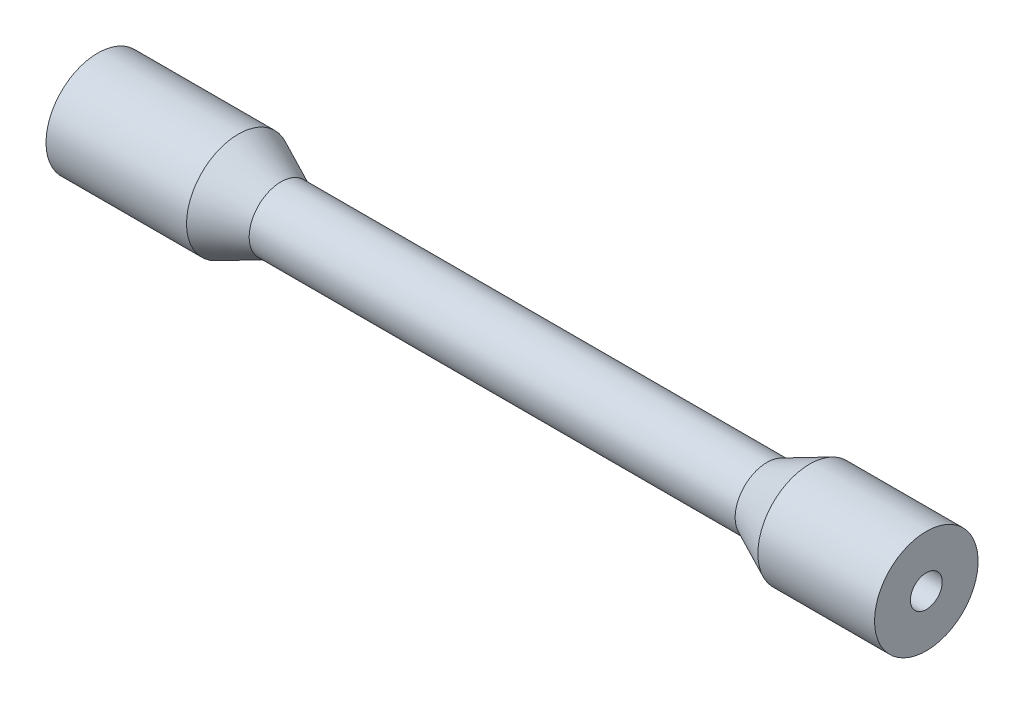
ISO-10303-21;
HEADER;
FILE_DESCRIPTION(('STEP AP214'),'2;1');
FILE_NAME('part.step','',(''),(''),'','','');
FILE_SCHEMA(('AUTOMOTIVE_DESIGN { 1 0 10303 214 1 1 1 1 }'));
ENDSEC;
DATA;
#1=APPLICATION_CONTEXT('core data for automotive mechanical design processes');
#2=APPLICATION_PROTOCOL_DEFINITION('international standard','automotive_design',2000,#1);
#3=PRODUCT_CONTEXT('',#1,'mechanical');
#4=PRODUCT('Part','Part','',(#3));
#5=PRODUCT_RELATED_PRODUCT_CATEGORY('part','',(#4));
#6=PRODUCT_DEFINITION_FORMATION('','',#4);
#7=PRODUCT_DEFINITION_CONTEXT('part definition',#1,'design');
#8=PRODUCT_DEFINITION('design','',#6,#7);
#9=PRODUCT_DEFINITION_SHAPE('','',#8);
#10=(LENGTH_UNIT() NAMED_UNIT(*) SI_UNIT(.MILLI.,.METRE.));
#11=(NAMED_UNIT(*) PLANE_ANGLE_UNIT() SI_UNIT($,.RADIAN.));
#12=(NAMED_UNIT(*) SI_UNIT($,.STERADIAN.) SOLID_ANGLE_UNIT());
#13=UNCERTAINTY_MEASURE_WITH_UNIT(LENGTH_MEASURE(1.E-05),#10,'distance_accuracy_value','');
#14=(GEOMETRIC_REPRESENTATION_CONTEXT(3) GLOBAL_UNCERTAINTY_ASSIGNED_CONTEXT((#13)) GLOBAL_UNIT_ASSIGNED_CONTEXT((#10,
#11,#12)) REPRESENTATION_CONTEXT('',''));
#15=CARTESIAN_POINT('',(0.,0.,0.));
#16=DIRECTION('',(0.,0.,1.));
#17=DIRECTION('',(1.,0.,0.));
#18=AXIS2_PLACEMENT_3D('',#15,#16,#17);
#19=CARTESIAN_POINT('',(26.,0.,0.));
#20=DIRECTION('',(-1.,0.,0.));
#21=DIRECTION('',(0.,0.,1.));
#22=AXIS2_PLACEMENT_3D('',#19,#20,#21);
#23=CYLINDRICAL_SURFACE('',#22,3.25);
#24=CARTESIAN_POINT('',(-26.,0.,0.));
#25=DIRECTION('',(1.,0.,0.));
#26=DIRECTION('',(0.,0.,-1.));
#27=AXIS2_PLACEMENT_3D('',#24,#25,#26);
#28=CIRCLE('',#27,3.25);
#29=CARTESIAN_POINT('',(-26.,0.,3.25));
#30=VERTEX_POINT('',#29);
#31=EDGE_CURVE('E40',#30,#30,#28,.T.);
#32=CARTESIAN_POINT('',(-17.180633650637,0.,0.));
#33=DIRECTION('',(-1.,0.,0.));
#34=DIRECTION('',(0.,0.,1.));
#35=AXIS2_PLACEMENT_3D('',#32,#33,#34);
#36=CIRCLE('',#35,3.25);
#37=CARTESIAN_POINT('',(-17.180633650637,0.,3.25));
#38=VERTEX_POINT('',#37);
#39=EDGE_CURVE('E52',#38,#38,#36,.T.);
#40=CARTESIAN_POINT('',(-26.,0.,3.25));
#41=CARTESIAN_POINT('',(-25.9081316005275,0.,3.25));
#42=CARTESIAN_POINT('',(-25.8162632010549,0.,3.25));
#43=CARTESIAN_POINT('',(-25.6325264021099,0.,3.25));
#44=CARTESIAN_POINT('',(-25.5406580026373,0.,3.25));
#45=CARTESIAN_POINT('',(-25.3569212036923,0.,3.25));
#46=CARTESIAN_POINT('',(-25.2650528042197,0.,3.25));
#47=CARTESIAN_POINT('',(-25.0813160052747,0.,3.25));
#48=CARTESIAN_POINT('',(-24.9894476058021,0.,3.25));
#49=CARTESIAN_POINT('',(-24.8057108068571,0.,3.25));
#50=CARTESIAN_POINT('',(-24.7138424073846,0.,3.25));
#51=CARTESIAN_POINT('',(-24.5301056084395,0.,3.25));
#52=CARTESIAN_POINT('',(-24.438237208967,0.,3.25));
#53=CARTESIAN_POINT('',(-24.2545004100219,0.,3.25));
#54=CARTESIAN_POINT('',(-24.1626320105494,0.,3.25));
#55=CARTESIAN_POINT('',(-23.9788952116043,0.,3.25));
#56=CARTESIAN_POINT('',(-23.8870268121318,0.,3.25));
#57=CARTESIAN_POINT('',(-23.7032900131867,0.,3.25));
#58=CARTESIAN_POINT('',(-23.6114216137142,0.,3.25));
#59=CARTESIAN_POINT('',(-23.4276848147691,0.,3.25));
#60=CARTESIAN_POINT('',(-23.3358164152966,0.,3.25));
#61=CARTESIAN_POINT('',(-23.1520796163515,0.,3.25));
#62=CARTESIAN_POINT('',(-23.060211216879,0.,3.25));
#63=CARTESIAN_POINT('',(-22.8764744179339,0.,3.25));
#64=CARTESIAN_POINT('',(-22.7846060184614,0.,3.25));
#65=CARTESIAN_POINT('',(-22.6008692195163,0.,3.25));
#66=CARTESIAN_POINT('',(-22.5090008200438,0.,3.25));
#67=CARTESIAN_POINT('',(-22.3252640210987,0.,3.25));
#68=CARTESIAN_POINT('',(-22.2333956216262,0.,3.25));
#69=CARTESIAN_POINT('',(-22.0496588226811,0.,3.25));
#70=CARTESIAN_POINT('',(-21.9577904232086,0.,3.25));
#71=CARTESIAN_POINT('',(-21.7740536242636,0.,3.25));
#72=CARTESIAN_POINT('',(-21.682185224791,0.,3.25));
#73=CARTESIAN_POINT('',(-21.498448425846,0.,3.25));
#74=CARTESIAN_POINT('',(-21.4065800263734,0.,3.25));
#75=CARTESIAN_POINT('',(-21.2228432274284,0.,3.25));
#76=CARTESIAN_POINT('',(-21.1309748279558,0.,3.25));
#77=CARTESIAN_POINT('',(-20.9472380290108,0.,3.25));
#78=CARTESIAN_POINT('',(-20.8553696295382,0.,3.25));
#79=CARTESIAN_POINT('',(-20.6716328305932,0.,3.25));
#80=CARTESIAN_POINT('',(-20.5797644311206,0.,3.25));
#81=CARTESIAN_POINT('',(-20.3960276321756,0.,3.25));
#82=CARTESIAN_POINT('',(-20.304159232703,0.,3.25));
#83=CARTESIAN_POINT('',(-20.120422433758,0.,3.25));
#84=CARTESIAN_POINT('',(-20.0285540342855,0.,3.25));
#85=CARTESIAN_POINT('',(-19.8448172353404,0.,3.25));
#86=CARTESIAN_POINT('',(-19.7529488358679,0.,3.25));
#87=CARTESIAN_POINT('',(-19.5692120369228,0.,3.25));
#88=CARTESIAN_POINT('',(-19.4773436374503,0.,3.25));
#89=CARTESIAN_POINT('',(-19.2936068385052,0.,3.25));
#90=CARTESIAN_POINT('',(-19.2017384390327,0.,3.25));
#91=CARTESIAN_POINT('',(-19.0180016400876,0.,3.25));
#92=CARTESIAN_POINT('',(-18.9261332406151,0.,3.25));
#93=CARTESIAN_POINT('',(-18.74239644167,0.,3.25));
#94=CARTESIAN_POINT('',(-18.6505280421975,0.,3.25));
#95=CARTESIAN_POINT('',(-18.4667912432524,0.,3.25));
#96=CARTESIAN_POINT('',(-18.3749228437799,0.,3.25));
#97=CARTESIAN_POINT('',(-18.1911860448348,0.,3.25));
#98=CARTESIAN_POINT('',(-18.0993176453623,0.,3.25));
#99=CARTESIAN_POINT('',(-17.9155808464172,0.,3.25));
#100=CARTESIAN_POINT('',(-17.8237124469447,0.,3.25));
#101=CARTESIAN_POINT('',(-17.6399756479996,0.,3.25));
#102=CARTESIAN_POINT('',(-17.5481072485271,0.,3.25));
#103=CARTESIAN_POINT('',(-17.364370449582,0.,3.25));
#104=CARTESIAN_POINT('',(-17.2725020501095,0.,3.25));
#105=CARTESIAN_POINT('',(-17.180633650637,0.,3.25));
#106=B_SPLINE_CURVE_WITH_KNOTS('',3,(#40,#41,#42,#43,#44,#45,#46,#47,#48,#49,#50,#51,#52,#53,
#54,#55,#56,#57,#58,#59,#60,#61,#62,#63,#64,#65,#66,#67,#68,#69,#70,#71,#72,#73,#74,#75,#76,#77,
#78,#79,#80,#81,#82,#83,#84,#85,#86,#87,#88,#89,#90,#91,#92,#93,#94,#95,#96,#97,#98,#99,#100,
#101,#102,#103,#104,#105),.UNSPECIFIED.,.F.,.F.,(4,2,2,2,2,2,2,2,2,2,2,2,2,2,2,2,2,2,2,2,2,2,2,
2,2,2,2,2,2,2,2,2,4),(0.,0.275605198417593,0.551210396835186,0.826815595252786,1.10242079367038,
1.37802599208797,1.65363119050557,1.92923638892316,2.20484158734076,2.48044678575835,
2.75605198417594,3.03165718259354,3.30726238101113,3.58286757942872,3.85847277784632,
4.13407797626392,4.40968317468151,4.6852883730991,4.9608935715167,5.23649876993429,
5.51210396835189,5.78770916676948,6.06331436518708,6.33891956360467,6.61452476202226,
6.89012996043986,7.16573515885745,7.44134035727505,7.71694555569264,7.99255075411023,
8.26815595252783,8.54376115094543,8.81936634936302),.UNSPECIFIED.);
#107=EDGE_CURVE('BSEAM37',#30,#38,#106,.T.);
#108=ORIENTED_EDGE('',*,*,#31,.T.);
#109=ORIENTED_EDGE('',*,*,#39,.T.);
#110=ORIENTED_EDGE('',*,*,#107,.T.);
#111=ORIENTED_EDGE('',*,*,#107,.F.);
#112=EDGE_LOOP('',(#108,#110,#109,#111));
#113=FACE_BOUND('',#112,.T.);
#114=ADVANCED_FACE('F37',(#113),#23,.T.);
#115=CARTESIAN_POINT('',(26.,0.,0.));
#116=DIRECTION('',(1.,0.,0.));
#117=DIRECTION('',(0.,0.,-1.));
#118=AXIS2_PLACEMENT_3D('',#115,#116,#117);
#119=CIRCLE('',#118,3.25);
#120=CARTESIAN_POINT('',(26.,0.,3.25));
#121=VERTEX_POINT('',#120);
#122=EDGE_CURVE('E10',#121,#121,#119,.T.);
#123=CARTESIAN_POINT('',(18.680633650637,0.,0.));
#124=DIRECTION('',(-1.,0.,0.));
#125=DIRECTION('',(0.,0.,1.));
#126=AXIS2_PLACEMENT_3D('',#123,#124,#125);
#127=CIRCLE('',#126,3.25);
#128=CARTESIAN_POINT('',(18.680633650637,0.,3.25));
#129=VERTEX_POINT('',#128);
#130=EDGE_CURVE('E57',#129,#129,#127,.T.);
#131=CARTESIAN_POINT('',(26.,0.,3.25));
#132=CARTESIAN_POINT('',(25.9237566005275,0.,3.25));
#133=CARTESIAN_POINT('',(25.8475132010549,0.,3.25));
#134=CARTESIAN_POINT('',(25.6950264021099,0.,3.25));
#135=CARTESIAN_POINT('',(25.6187830026373,0.,3.25));
#136=CARTESIAN_POINT('',(25.4662962036923,0.,3.25));
#137=CARTESIAN_POINT('',(25.3900528042197,0.,3.25));
#138=CARTESIAN_POINT('',(25.2375660052747,0.,3.25));
#139=CARTESIAN_POINT('',(25.1613226058022,0.,3.25));
#140=CARTESIAN_POINT('',(25.0088358068571,0.,3.25));
#141=CARTESIAN_POINT('',(24.9325924073846,0.,3.25));
#142=CARTESIAN_POINT('',(24.7801056084395,0.,3.25));
#143=CARTESIAN_POINT('',(24.703862208967,0.,3.25));
#144=CARTESIAN_POINT('',(24.5513754100219,0.,3.25));
#145=CARTESIAN_POINT('',(24.4751320105494,0.,3.25));
#146=CARTESIAN_POINT('',(24.3226452116043,0.,3.25));
#147=CARTESIAN_POINT('',(24.2464018121318,0.,3.25));
#148=CARTESIAN_POINT('',(24.0939150131867,0.,3.25));
#149=CARTESIAN_POINT('',(24.0176716137142,0.,3.25));
#150=CARTESIAN_POINT('',(23.8651848147691,0.,3.25));
#151=CARTESIAN_POINT('',(23.7889414152966,0.,3.25));
#152=CARTESIAN_POINT('',(23.6364546163515,0.,3.25));
#153=CARTESIAN_POINT('',(23.560211216879,0.,3.25));
#154=CARTESIAN_POINT('',(23.4077244179339,0.,3.25));
#155=CARTESIAN_POINT('',(23.3314810184614,0.,3.25));
#156=CARTESIAN_POINT('',(23.1789942195163,0.,3.25));
#157=CARTESIAN_POINT('',(23.1027508200438,0.,3.25));
#158=CARTESIAN_POINT('',(22.9502640210987,0.,3.25));
#159=CARTESIAN_POINT('',(22.8740206216262,0.,3.25));
#160=CARTESIAN_POINT('',(22.7215338226812,0.,3.25));
#161=CARTESIAN_POINT('',(22.6452904232086,0.,3.25));
#162=CARTESIAN_POINT('',(22.4928036242636,0.,3.25));
#163=CARTESIAN_POINT('',(22.416560224791,0.,3.25));
#164=CARTESIAN_POINT('',(22.264073425846,0.,3.25));
#165=CARTESIAN_POINT('',(22.1878300263734,0.,3.25));
#166=CARTESIAN_POINT('',(22.0353432274284,0.,3.25));
#167=CARTESIAN_POINT('',(21.9590998279558,0.,3.25));
#168=CARTESIAN_POINT('',(21.8066130290108,0.,3.25));
#169=CARTESIAN_POINT('',(21.7303696295382,0.,3.25));
#170=CARTESIAN_POINT('',(21.5778828305932,0.,3.25));
#171=CARTESIAN_POINT('',(21.5016394311206,0.,3.25));
#172=CARTESIAN_POINT('',(21.3491526321756,0.,3.25));
#173=CARTESIAN_POINT('',(21.2729092327031,0.,3.25));
#174=CARTESIAN_POINT('',(21.120422433758,0.,3.25));
#175=CARTESIAN_POINT('',(21.0441790342855,0.,3.25));
#176=CARTESIAN_POINT('',(20.8916922353404,0.,3.25));
#177=CARTESIAN_POINT('',(20.8154488358679,0.,3.25));
#178=CARTESIAN_POINT('',(20.6629620369228,0.,3.25));
#179=CARTESIAN_POINT('',(20.5867186374503,0.,3.25));
#180=CARTESIAN_POINT('',(20.4342318385052,0.,3.25));
#181=CARTESIAN_POINT('',(20.3579884390327,0.,3.25));
#182=CARTESIAN_POINT('',(20.2055016400876,0.,3.25));
#183=CARTESIAN_POINT('',(20.1292582406151,0.,3.25));
#184=CARTESIAN_POINT('',(19.97677144167,0.,3.25));
#185=CARTESIAN_POINT('',(19.9005280421975,0.,3.25));
#186=CARTESIAN_POINT('',(19.7480412432524,0.,3.25));
#187=CARTESIAN_POINT('',(19.6717978437799,0.,3.25));
#188=CARTESIAN_POINT('',(19.5193110448348,0.,3.25));
#189=CARTESIAN_POINT('',(19.4430676453623,0.,3.25));
#190=CARTESIAN_POINT('',(19.2905808464172,0.,3.25));
#191=CARTESIAN_POINT('',(19.2143374469447,0.,3.25));
#192=CARTESIAN_POINT('',(19.0618506479996,0.,3.25));
#193=CARTESIAN_POINT('',(18.9856072485271,0.,3.25));
#194=CARTESIAN_POINT('',(18.8331204495821,0.,3.25));
#195=CARTESIAN_POINT('',(18.7568770501095,0.,3.25));
#196=CARTESIAN_POINT('',(18.680633650637,0.,3.25));
#197=B_SPLINE_CURVE_WITH_KNOTS('',3,(#131,#132,#133,#134,#135,#136,#137,#138,#139,#140,#141,
#142,#143,#144,#145,#146,#147,#148,#149,#150,#151,#152,#153,#154,#155,#156,#157,#158,#159,#160,
#161,#162,#163,#164,#165,#166,#167,#168,#169,#170,#171,#172,#173,#174,#175,#176,#177,#178,#179,
#180,#181,#182,#183,#184,#185,#186,#187,#188,#189,#190,#191,#192,#193,#194,#195,#196),
.UNSPECIFIED.,.F.,.F.,(4,2,2,2,2,2,2,2,2,2,2,2,2,2,2,2,2,2,2,2,2,2,2,2,2,2,2,2,2,2,2,2,4),(0.,
0.228730198417595,0.45746039683519,0.686190595252784,0.914920793670379,1.14365099208797,
1.37238119050557,1.60111138892316,1.82984158734075,2.05857178575835,2.28730198417594,
2.51603218259354,2.74476238101113,2.97349257942872,3.20222277784632,3.43095297626391,
3.65968317468151,3.8884133730991,4.11714357151669,4.34587376993429,4.57460396835188,
4.80333416676948,5.03206436518707,5.26079456360467,5.48952476202226,5.71825496043985,
5.94698515885745,6.17571535727504,6.40444555569264,6.63317575411023,6.86190595252782,
7.09063615094542,7.31936634936301),.UNSPECIFIED.);
#198=EDGE_CURVE('BSEAM81',#121,#129,#197,.T.);
#199=ORIENTED_EDGE('',*,*,#122,.F.);
#200=ORIENTED_EDGE('',*,*,#130,.F.);
#201=ORIENTED_EDGE('',*,*,#198,.T.);
#202=ORIENTED_EDGE('',*,*,#198,.F.);
#203=EDGE_LOOP('',(#199,#201,#200,#202));
#204=FACE_BOUND('',#203,.T.);
#205=ADVANCED_FACE('F81',(#204),#23,.T.);
#206=CARTESIAN_POINT('',(26.,0.,0.));
#207=DIRECTION('',(1.,0.,0.));
#208=DIRECTION('',(0.,0.,-1.));
#209=AXIS2_PLACEMENT_3D('',#206,#207,#208);
#210=PLANE('',#209);
#211=ORIENTED_EDGE('',*,*,#122,.T.);
#212=EDGE_LOOP('',(#211));
#213=FACE_BOUND('',#212,.T.);
#214=CARTESIAN_POINT('',(26.,0.,0.));
#215=DIRECTION('',(1.,0.,0.));
#216=DIRECTION('',(0.,0.,-1.));
#217=AXIS2_PLACEMENT_3D('',#214,#215,#216);
#218=CIRCLE('',#217,1.);
#219=CARTESIAN_POINT('',(26.,0.,1.));
#220=VERTEX_POINT('',#219);
#221=EDGE_CURVE('E47',#220,#220,#218,.T.);
#222=ORIENTED_EDGE('',*,*,#221,.F.);
#223=EDGE_LOOP('',(#222));
#224=FACE_BOUND('',#223,.T.);
#225=ADVANCED_FACE('F86',(#213,#224),#210,.T.);
#226=CARTESIAN_POINT('',(-26.,0.,0.));
#227=DIRECTION('',(1.,0.,0.));
#228=DIRECTION('',(0.,0.,-1.));
#229=AXIS2_PLACEMENT_3D('',#226,#227,#228);
#230=PLANE('',#229);
#231=ORIENTED_EDGE('',*,*,#31,.F.);
#232=EDGE_LOOP('',(#231));
#233=FACE_BOUND('',#232,.T.);
#234=CARTESIAN_POINT('',(-26.,0.,0.));
#235=DIRECTION('',(1.,0.,0.));
#236=DIRECTION('',(0.,0.,-1.));
#237=AXIS2_PLACEMENT_3D('',#234,#235,#236);
#238=CIRCLE('',#237,1.);
#239=CARTESIAN_POINT('',(-26.,0.,1.));
#240=VERTEX_POINT('',#239);
#241=EDGE_CURVE('E49',#240,#240,#238,.T.);
#242=ORIENTED_EDGE('',*,*,#241,.T.);
#243=EDGE_LOOP('',(#242));
#244=FACE_BOUND('',#243,.T.);
#245=ADVANCED_FACE('F97',(#233,#244),#230,.F.);
#246=CARTESIAN_POINT('',(26.,0.,0.));
#247=DIRECTION('',(-1.,0.,0.));
#248=DIRECTION('',(0.,0.,1.));
#249=AXIS2_PLACEMENT_3D('',#246,#247,#248);
#250=CYLINDRICAL_SURFACE('',#249,1.);
#251=CARTESIAN_POINT('',(26.,0.,1.));
#252=CARTESIAN_POINT('',(25.4583333333333,0.,1.));
#253=CARTESIAN_POINT('',(24.9166666666667,0.,1.));
#254=CARTESIAN_POINT('',(23.8333333333333,0.,1.));
#255=CARTESIAN_POINT('',(23.2916666666667,0.,1.));
#256=CARTESIAN_POINT('',(22.2083333333333,0.,1.));
#257=CARTESIAN_POINT('',(21.6666666666667,0.,1.));
#258=CARTESIAN_POINT('',(20.5833333333333,0.,1.));
#259=CARTESIAN_POINT('',(20.0416666666667,0.,1.));
#260=CARTESIAN_POINT('',(18.9583333333333,0.,1.));
#261=CARTESIAN_POINT('',(18.4166666666667,0.,1.));
#262=CARTESIAN_POINT('',(17.3333333333333,0.,1.));
#263=CARTESIAN_POINT('',(16.7916666666667,0.,1.));
#264=CARTESIAN_POINT('',(15.7083333333333,0.,1.));
#265=CARTESIAN_POINT('',(15.1666666666667,0.,1.));
#266=CARTESIAN_POINT('',(14.0833333333333,0.,1.));
#267=CARTESIAN_POINT('',(13.5416666666667,0.,1.));
#268=CARTESIAN_POINT('',(12.4583333333333,0.,1.));
#269=CARTESIAN_POINT('',(11.9166666666667,0.,1.));
#270=CARTESIAN_POINT('',(10.8333333333333,0.,1.));
#271=CARTESIAN_POINT('',(10.2916666666667,0.,1.));
#272=CARTESIAN_POINT('',(9.20833333333333,0.,1.));
#273=CARTESIAN_POINT('',(8.66666666666667,0.,1.));
#274=CARTESIAN_POINT('',(7.58333333333333,0.,1.));
#275=CARTESIAN_POINT('',(7.04166666666667,0.,1.));
#276=CARTESIAN_POINT('',(5.95833333333333,0.,1.));
#277=CARTESIAN_POINT('',(5.41666666666667,0.,1.));
#278=CARTESIAN_POINT('',(4.33333333333333,0.,1.));
#279=CARTESIAN_POINT('',(3.79166666666667,0.,1.));
#280=CARTESIAN_POINT('',(2.70833333333333,0.,1.));
#281=CARTESIAN_POINT('',(2.16666666666667,0.,1.));
#282=CARTESIAN_POINT('',(1.08333333333333,0.,1.));
#283=CARTESIAN_POINT('',(0.541666666666667,0.,1.));
#284=CARTESIAN_POINT('',(-0.541666666666667,0.,1.));
#285=CARTESIAN_POINT('',(-1.08333333333333,0.,1.));
#286=CARTESIAN_POINT('',(-2.16666666666667,0.,1.));
#287=CARTESIAN_POINT('',(-2.70833333333333,0.,1.));
#288=CARTESIAN_POINT('',(-3.79166666666667,0.,1.));
#289=CARTESIAN_POINT('',(-4.33333333333333,0.,1.));
#290=CARTESIAN_POINT('',(-5.41666666666667,0.,1.));
#291=CARTESIAN_POINT('',(-5.95833333333333,0.,1.));
#292=CARTESIAN_POINT('',(-7.04166666666666,0.,1.));
#293=CARTESIAN_POINT('',(-7.58333333333333,0.,1.));
#294=CARTESIAN_POINT('',(-8.66666666666666,0.,1.));
#295=CARTESIAN_POINT('',(-9.20833333333333,0.,1.));
#296=CARTESIAN_POINT('',(-10.2916666666667,0.,1.));
#297=CARTESIAN_POINT('',(-10.8333333333333,0.,1.));
#298=CARTESIAN_POINT('',(-11.9166666666667,0.,1.));
#299=CARTESIAN_POINT('',(-12.4583333333333,0.,1.));
#300=CARTESIAN_POINT('',(-13.5416666666667,0.,1.));
#301=CARTESIAN_POINT('',(-14.0833333333333,0.,1.));
#302=CARTESIAN_POINT('',(-15.1666666666667,0.,1.));
#303=CARTESIAN_POINT('',(-15.7083333333333,0.,1.));
#304=CARTESIAN_POINT('',(-16.7916666666667,0.,1.));
#305=CARTESIAN_POINT('',(-17.3333333333333,0.,1.));
#306=CARTESIAN_POINT('',(-18.4166666666667,0.,1.));
#307=CARTESIAN_POINT('',(-18.9583333333333,0.,1.));
#308=CARTESIAN_POINT('',(-20.0416666666667,0.,1.));
#309=CARTESIAN_POINT('',(-20.5833333333333,0.,1.));
#310=CARTESIAN_POINT('',(-21.6666666666667,0.,1.));
#311=CARTESIAN_POINT('',(-22.2083333333333,0.,1.));
#312=CARTESIAN_POINT('',(-23.2916666666667,0.,1.));
#313=CARTESIAN_POINT('',(-23.8333333333333,0.,1.));
#314=CARTESIAN_POINT('',(-24.9166666666667,0.,1.));
#315=CARTESIAN_POINT('',(-25.4583333333333,0.,1.));
#316=CARTESIAN_POINT('',(-26.,0.,1.));
#317=B_SPLINE_CURVE_WITH_KNOTS('',3,(#251,#252,#253,#254,#255,#256,#257,#258,#259,#260,#261,
#262,#263,#264,#265,#266,#267,#268,#269,#270,#271,#272,#273,#274,#275,#276,#277,#278,#279,#280,
#281,#282,#283,#284,#285,#286,#287,#288,#289,#290,#291,#292,#293,#294,#295,#296,#297,#298,#299,
#300,#301,#302,#303,#304,#305,#306,#307,#308,#309,#310,#311,#312,#313,#314,#315,#316),
.UNSPECIFIED.,.F.,.F.,(4,2,2,2,2,2,2,2,2,2,2,2,2,2,2,2,2,2,2,2,2,2,2,2,2,2,2,2,2,2,2,2,4),(0.,
1.625,3.25,4.875,6.5,8.125,9.75,11.375,13.,14.625,16.25,17.875,19.5,21.125,22.75,24.375,26.,
27.625,29.25,30.875,32.5,34.125,35.75,37.375,39.,40.625,42.25,43.875,45.5,47.125,48.75,50.375,
52.),.UNSPECIFIED.);
#318=EDGE_CURVE('BSEAM92',#220,#240,#317,.T.);
#319=ORIENTED_EDGE('',*,*,#221,.T.);
#320=ORIENTED_EDGE('',*,*,#241,.F.);
#321=ORIENTED_EDGE('',*,*,#318,.T.);
#322=ORIENTED_EDGE('',*,*,#318,.F.);
#323=EDGE_LOOP('',(#319,#321,#320,#322));
#324=FACE_BOUND('',#323,.T.);
#325=ADVANCED_FACE('F92',(#324),#250,.F.);
#326=CARTESIAN_POINT('',(-17.180633650637,0.,0.));
#327=DIRECTION('',(-1.,0.,0.));
#328=DIRECTION('',(0.,0.,1.));
#329=AXIS2_PLACEMENT_3D('',#326,#327,#328);
#330=CONICAL_SURFACE('',#329,3.25,0.436332312998576);
#331=CARTESIAN_POINT('',(-14.5,0.,0.));
#332=DIRECTION('',(-1.,0.,0.));
#333=DIRECTION('',(0.,0.,1.));
#334=AXIS2_PLACEMENT_3D('',#331,#332,#333);
#335=CIRCLE('',#334,2.);
#336=CARTESIAN_POINT('',(-14.5,0.,2.));
#337=VERTEX_POINT('',#336);
#338=EDGE_CURVE('E63',#337,#337,#335,.T.);
#339=ORIENTED_EDGE('',*,*,#338,.T.);
#340=EDGE_LOOP('',(#339));
#341=FACE_BOUND('',#340,.T.);
#342=ORIENTED_EDGE('',*,*,#39,.F.);
#343=EDGE_LOOP('',(#342));
#344=FACE_BOUND('',#343,.T.);
#345=ADVANCED_FACE('F67',(#341,#344),#330,.T.);
#346=CARTESIAN_POINT('',(16.,0.,0.));
#347=DIRECTION('',(1.,0.,0.));
#348=DIRECTION('',(0.,0.,-1.));
#349=AXIS2_PLACEMENT_3D('',#346,#347,#348);
#350=CONICAL_SURFACE('',#349,2.,0.436332312998575);
#351=ORIENTED_EDGE('',*,*,#130,.T.);
#352=EDGE_LOOP('',(#351));
#353=FACE_BOUND('',#352,.T.);
#354=CARTESIAN_POINT('',(16.,0.,0.));
#355=DIRECTION('',(-1.,0.,0.));
#356=DIRECTION('',(0.,0.,1.));
#357=AXIS2_PLACEMENT_3D('',#354,#355,#356);
#358=CIRCLE('',#357,2.);
#359=CARTESIAN_POINT('',(16.,0.,2.));
#360=VERTEX_POINT('',#359);
#361=EDGE_CURVE('E60',#360,#360,#358,.T.);
#362=ORIENTED_EDGE('',*,*,#361,.F.);
#363=EDGE_LOOP('',(#362));
#364=FACE_BOUND('',#363,.T.);
#365=ADVANCED_FACE('F72',(#353,#364),#350,.T.);
#366=CARTESIAN_POINT('',(-26.,0.,0.));
#367=DIRECTION('',(-1.,0.,0.));
#368=DIRECTION('',(0.,0.,1.));
#369=AXIS2_PLACEMENT_3D('',#366,#367,#368);
#370=CYLINDRICAL_SURFACE('',#369,2.);
#371=ORIENTED_EDGE('',*,*,#361,.T.);
#372=EDGE_LOOP('',(#371));
#373=FACE_BOUND('',#372,.T.);
#374=ORIENTED_EDGE('',*,*,#338,.F.);
#375=EDGE_LOOP('',(#374));
#376=FACE_BOUND('',#375,.T.);
#377=ADVANCED_FACE('F70',(#373,#376),#370,.T.);
#378=CLOSED_SHELL('',(#114,#205,#225,#245,#325,#345,#365,#377));
#379=MANIFOLD_SOLID_BREP('B2',#378);
#380=ADVANCED_BREP_SHAPE_REPRESENTATION('',(#18,#379),#14);
#381=SHAPE_DEFINITION_REPRESENTATION(#9,#380);
ENDSEC;
END-ISO-10303-21;
